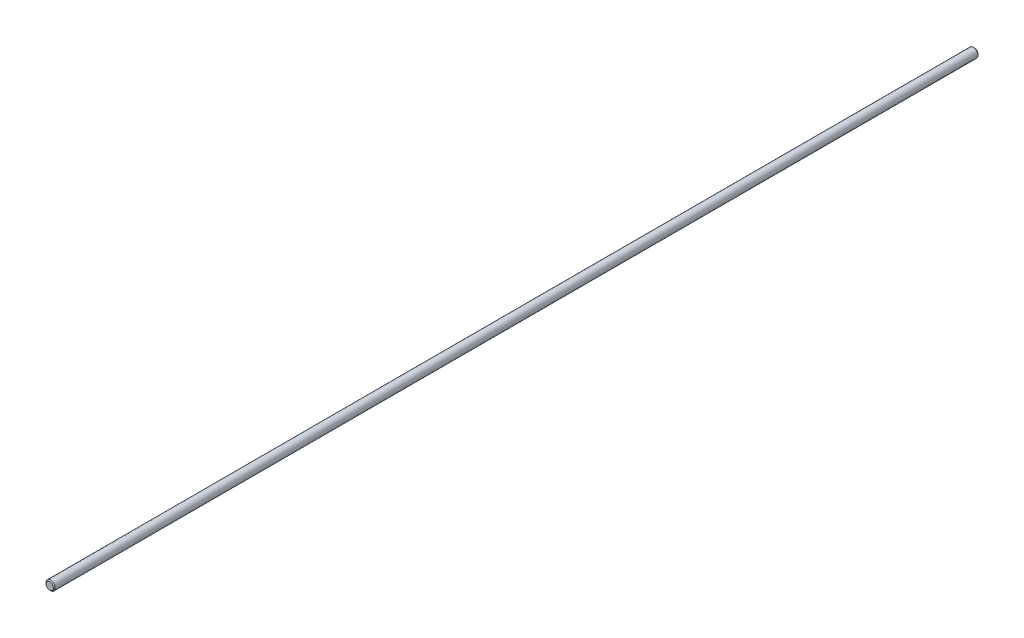
ISO-10303-21;
HEADER;
FILE_DESCRIPTION(('STEP AP214'),'2;1');
FILE_NAME('part.step','',(''),(''),'','','');
FILE_SCHEMA(('AUTOMOTIVE_DESIGN { 1 0 10303 214 1 1 1 1 }'));
ENDSEC;
DATA;
#1=APPLICATION_CONTEXT('core data for automotive mechanical design processes');
#2=APPLICATION_PROTOCOL_DEFINITION('international standard','automotive_design',2000,#1);
#3=PRODUCT_CONTEXT('',#1,'mechanical');
#4=PRODUCT('Part','Part','',(#3));
#5=PRODUCT_RELATED_PRODUCT_CATEGORY('part','',(#4));
#6=PRODUCT_DEFINITION_FORMATION('','',#4);
#7=PRODUCT_DEFINITION_CONTEXT('part definition',#1,'design');
#8=PRODUCT_DEFINITION('design','',#6,#7);
#9=PRODUCT_DEFINITION_SHAPE('','',#8);
#10=(LENGTH_UNIT() NAMED_UNIT(*) SI_UNIT(.MILLI.,.METRE.));
#11=(NAMED_UNIT(*) PLANE_ANGLE_UNIT() SI_UNIT($,.RADIAN.));
#12=(NAMED_UNIT(*) SI_UNIT($,.STERADIAN.) SOLID_ANGLE_UNIT());
#13=UNCERTAINTY_MEASURE_WITH_UNIT(LENGTH_MEASURE(1.E-05),#10,'distance_accuracy_value','');
#14=(GEOMETRIC_REPRESENTATION_CONTEXT(3) GLOBAL_UNCERTAINTY_ASSIGNED_CONTEXT((#13)) GLOBAL_UNIT_ASSIGNED_CONTEXT((#10,
#11,#12)) REPRESENTATION_CONTEXT('',''));
#15=CARTESIAN_POINT('',(0.,0.,0.));
#16=DIRECTION('',(0.,0.,1.));
#17=DIRECTION('',(1.,0.,0.));
#18=AXIS2_PLACEMENT_3D('',#15,#16,#17);
#19=CARTESIAN_POINT('',(0.,0.,500.));
#20=DIRECTION('',(0.,0.,-1.));
#21=DIRECTION('',(-1.,0.,0.));
#22=AXIS2_PLACEMENT_3D('',#19,#20,#21);
#23=CYLINDRICAL_SURFACE('',#22,2.495);
#24=CARTESIAN_POINT('',(0.,0.,499.5));
#25=DIRECTION('',(0.,0.,1.));
#26=DIRECTION('',(1.,0.,0.));
#27=AXIS2_PLACEMENT_3D('',#24,#25,#26);
#28=CIRCLE('',#27,2.495);
#29=CARTESIAN_POINT('',(2.495,0.,499.5));
#30=VERTEX_POINT('',#29);
#31=EDGE_CURVE('E38',#30,#30,#28,.F.);
#32=ORIENTED_EDGE('',*,*,#31,.T.);
#33=EDGE_LOOP('',(#32));
#34=FACE_BOUND('',#33,.T.);
#35=CARTESIAN_POINT('',(0.,0.,0.500000000000056));
#36=DIRECTION('',(0.,0.,1.));
#37=DIRECTION('',(1.,0.,0.));
#38=AXIS2_PLACEMENT_3D('',#35,#36,#37);
#39=CIRCLE('',#38,2.495);
#40=CARTESIAN_POINT('',(2.495,0.,0.500000000000056));
#41=VERTEX_POINT('',#40);
#42=EDGE_CURVE('E42',#41,#41,#39,.T.);
#43=ORIENTED_EDGE('',*,*,#42,.T.);
#44=EDGE_LOOP('',(#43));
#45=FACE_BOUND('',#44,.T.);
#46=ADVANCED_FACE('F31',(#34,#45),#23,.T.);
#47=CARTESIAN_POINT('',(0.,0.,500.));
#48=DIRECTION('',(0.,0.,1.));
#49=DIRECTION('',(1.,0.,0.));
#50=AXIS2_PLACEMENT_3D('',#47,#48,#49);
#51=PLANE('',#50);
#52=CARTESIAN_POINT('',(0.,0.,500.));
#53=DIRECTION('',(0.,0.,1.));
#54=DIRECTION('',(1.,0.,0.));
#55=AXIS2_PLACEMENT_3D('',#52,#53,#54);
#56=CIRCLE('',#55,1.99499999999997);
#57=CARTESIAN_POINT('',(1.99499999999997,0.,500.));
#58=VERTEX_POINT('',#57);
#59=EDGE_CURVE('E46',#58,#58,#56,.T.);
#60=ORIENTED_EDGE('',*,*,#59,.T.);
#61=EDGE_LOOP('',(#60));
#62=FACE_BOUND('',#61,.T.);
#63=ADVANCED_FACE('F52',(#62),#51,.T.);
#64=CARTESIAN_POINT('',(0.,0.,0.));
#65=DIRECTION('',(0.,0.,1.));
#66=DIRECTION('',(1.,0.,0.));
#67=AXIS2_PLACEMENT_3D('',#64,#65,#66);
#68=PLANE('',#67);
#69=CARTESIAN_POINT('',(0.,0.,0.));
#70=DIRECTION('',(0.,0.,1.));
#71=DIRECTION('',(1.,0.,0.));
#72=AXIS2_PLACEMENT_3D('',#69,#70,#71);
#73=CIRCLE('',#72,1.99499999999991);
#74=CARTESIAN_POINT('',(1.99499999999991,0.,0.));
#75=VERTEX_POINT('',#74);
#76=EDGE_CURVE('E10',#75,#75,#73,.F.);
#77=ORIENTED_EDGE('',*,*,#76,.T.);
#78=EDGE_LOOP('',(#77));
#79=FACE_BOUND('',#78,.T.);
#80=ADVANCED_FACE('F56',(#79),#68,.F.);
#81=CARTESIAN_POINT('',(0.,0.,500.));
#82=DIRECTION('',(0.,0.,-1.));
#83=DIRECTION('',(-1.,0.,0.));
#84=AXIS2_PLACEMENT_3D('',#81,#82,#83);
#85=CONICAL_SURFACE('',#84,1.99499999999997,0.785398163397424);
#86=ORIENTED_EDGE('',*,*,#31,.F.);
#87=EDGE_LOOP('',(#86));
#88=FACE_BOUND('',#87,.T.);
#89=ORIENTED_EDGE('',*,*,#59,.F.);
#90=EDGE_LOOP('',(#89));
#91=FACE_BOUND('',#90,.T.);
#92=ADVANCED_FACE('F54',(#88,#91),#85,.T.);
#93=CARTESIAN_POINT('',(0.,0.,0.500000000000056));
#94=DIRECTION('',(0.,0.,1.));
#95=DIRECTION('',(1.,0.,0.));
#96=AXIS2_PLACEMENT_3D('',#93,#94,#95);
#97=CONICAL_SURFACE('',#96,2.495,0.785398163397479);
#98=ORIENTED_EDGE('',*,*,#76,.F.);
#99=EDGE_LOOP('',(#98));
#100=FACE_BOUND('',#99,.T.);
#101=ORIENTED_EDGE('',*,*,#42,.F.);
#102=EDGE_LOOP('',(#101));
#103=FACE_BOUND('',#102,.T.);
#104=ADVANCED_FACE('F33',(#100,#103),#97,.T.);
#105=CLOSED_SHELL('',(#46,#63,#80,#92,#104));
#106=MANIFOLD_SOLID_BREP('B2',#105);
#107=ADVANCED_BREP_SHAPE_REPRESENTATION('',(#18,#106),#14);
#108=SHAPE_DEFINITION_REPRESENTATION(#9,#107);
ENDSEC;
END-ISO-10303-21;
